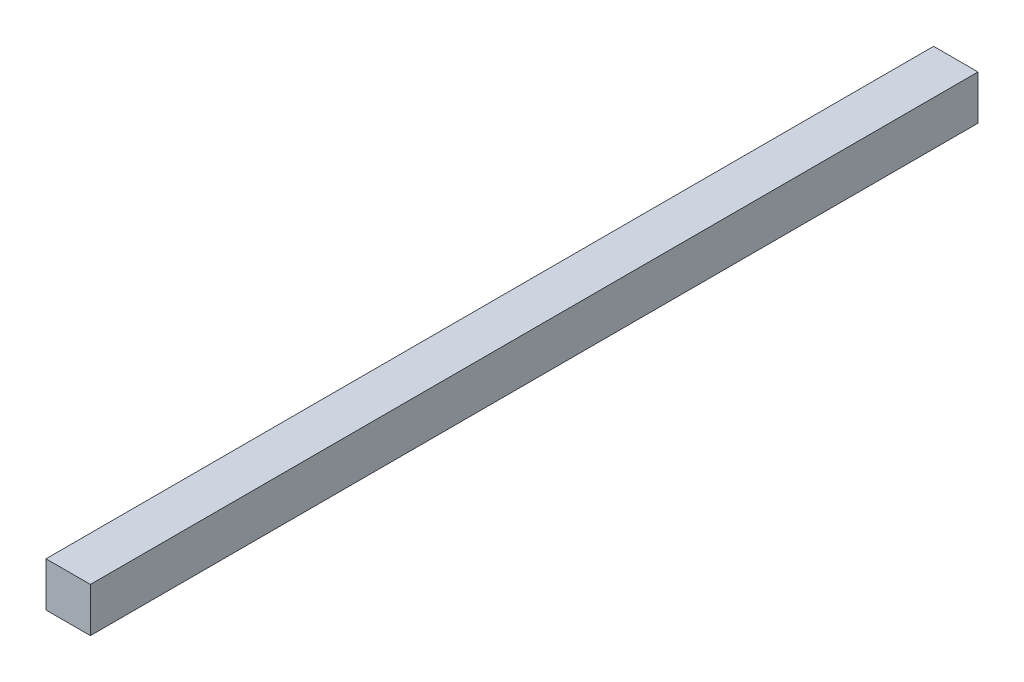
ISO-10303-21;
HEADER;
FILE_DESCRIPTION(('STEP AP214'),'2;1');
FILE_NAME('part.step','',(''),(''),'','','');
FILE_SCHEMA(('AUTOMOTIVE_DESIGN { 1 0 10303 214 1 1 1 1 }'));
ENDSEC;
DATA;
#1=APPLICATION_CONTEXT('core data for automotive mechanical design processes');
#2=APPLICATION_PROTOCOL_DEFINITION('international standard','automotive_design',2000,#1);
#3=PRODUCT_CONTEXT('',#1,'mechanical');
#4=PRODUCT('Part','Part','',(#3));
#5=PRODUCT_RELATED_PRODUCT_CATEGORY('part','',(#4));
#6=PRODUCT_DEFINITION_FORMATION('','',#4);
#7=PRODUCT_DEFINITION_CONTEXT('part definition',#1,'design');
#8=PRODUCT_DEFINITION('design','',#6,#7);
#9=PRODUCT_DEFINITION_SHAPE('','',#8);
#10=(LENGTH_UNIT() NAMED_UNIT(*) SI_UNIT(.MILLI.,.METRE.));
#11=(NAMED_UNIT(*) PLANE_ANGLE_UNIT() SI_UNIT($,.RADIAN.));
#12=(NAMED_UNIT(*) SI_UNIT($,.STERADIAN.) SOLID_ANGLE_UNIT());
#13=UNCERTAINTY_MEASURE_WITH_UNIT(LENGTH_MEASURE(1.E-05),#10,'distance_accuracy_value','');
#14=(GEOMETRIC_REPRESENTATION_CONTEXT(3) GLOBAL_UNCERTAINTY_ASSIGNED_CONTEXT((#13)) GLOBAL_UNIT_ASSIGNED_CONTEXT((#10,
#11,#12)) REPRESENTATION_CONTEXT('',''));
#15=CARTESIAN_POINT('',(0.,0.,0.));
#16=DIRECTION('',(0.,0.,1.));
#17=DIRECTION('',(1.,0.,0.));
#18=AXIS2_PLACEMENT_3D('',#15,#16,#17);
#19=CARTESIAN_POINT('',(-3.,3.,300.));
#20=DIRECTION('',(-1.,0.,0.));
#21=DIRECTION('',(0.,-1.,0.));
#22=AXIS2_PLACEMENT_3D('',#19,#20,#21);
#23=PLANE('',#22);
#24=DIRECTION('',(0.,0.,-1.));
#25=VECTOR('',#24,1.);
#26=CARTESIAN_POINT('',(-3.,3.,300.));
#27=LINE('',#26,#25);
#28=CARTESIAN_POINT('',(-3.,3.,300.));
#29=VERTEX_POINT('',#28);
#30=CARTESIAN_POINT('',(-3.,3.,180.));
#31=VERTEX_POINT('',#30);
#32=EDGE_CURVE('E114',#29,#31,#27,.T.);
#33=ORIENTED_EDGE('',*,*,#32,.T.);
#34=DIRECTION('',(0.,-1.,0.));
#35=VECTOR('',#34,1.);
#36=CARTESIAN_POINT('',(-3.,3.,180.));
#37=LINE('',#36,#35);
#38=CARTESIAN_POINT('',(-3.,-3.,180.));
#39=VERTEX_POINT('',#38);
#40=EDGE_CURVE('E72',#31,#39,#37,.T.);
#41=ORIENTED_EDGE('',*,*,#40,.T.);
#42=DIRECTION('',(0.,0.,-1.));
#43=VECTOR('',#42,1.);
#44=CARTESIAN_POINT('',(-3.,-3.,300.));
#45=LINE('',#44,#43);
#46=CARTESIAN_POINT('',(-3.,-3.,300.));
#47=VERTEX_POINT('',#46);
#48=EDGE_CURVE('E65',#47,#39,#45,.T.);
#49=ORIENTED_EDGE('',*,*,#48,.F.);
#50=DIRECTION('',(0.,1.,0.));
#51=VECTOR('',#50,1.);
#52=CARTESIAN_POINT('',(-3.,3.,300.));
#53=LINE('',#52,#51);
#54=EDGE_CURVE('E79',#47,#29,#53,.T.);
#55=ORIENTED_EDGE('',*,*,#54,.T.);
#56=EDGE_LOOP('',(#33,#41,#49,#55));
#57=FACE_BOUND('',#56,.T.);
#58=ADVANCED_FACE('F57',(#57),#23,.T.);
#59=CARTESIAN_POINT('',(3.,-3.,300.));
#60=DIRECTION('',(0.,-1.,0.));
#61=DIRECTION('',(0.,0.,-1.));
#62=AXIS2_PLACEMENT_3D('',#59,#60,#61);
#63=PLANE('',#62);
#64=ORIENTED_EDGE('',*,*,#48,.T.);
#65=DIRECTION('',(1.,0.,0.));
#66=VECTOR('',#65,1.);
#67=CARTESIAN_POINT('',(3.,-3.,180.));
#68=LINE('',#67,#66);
#69=CARTESIAN_POINT('',(3.,-3.,180.));
#70=VERTEX_POINT('',#69);
#71=EDGE_CURVE('E108',#39,#70,#68,.T.);
#72=ORIENTED_EDGE('',*,*,#71,.T.);
#73=DIRECTION('',(0.,0.,-1.));
#74=VECTOR('',#73,1.);
#75=CARTESIAN_POINT('',(3.,-3.,300.));
#76=LINE('',#75,#74);
#77=CARTESIAN_POINT('',(3.,-3.,300.));
#78=VERTEX_POINT('',#77);
#79=EDGE_CURVE('E107',#78,#70,#76,.T.);
#80=ORIENTED_EDGE('',*,*,#79,.F.);
#81=DIRECTION('',(-1.,0.,0.));
#82=VECTOR('',#81,1.);
#83=CARTESIAN_POINT('',(3.,-3.,300.));
#84=LINE('',#83,#82);
#85=EDGE_CURVE('E117',#78,#47,#84,.T.);
#86=ORIENTED_EDGE('',*,*,#85,.T.);
#87=EDGE_LOOP('',(#64,#72,#80,#86));
#88=FACE_BOUND('',#87,.T.);
#89=ADVANCED_FACE('F129',(#88),#63,.T.);
#90=CARTESIAN_POINT('',(3.,3.,300.));
#91=DIRECTION('',(1.,0.,0.));
#92=DIRECTION('',(0.,1.,0.));
#93=AXIS2_PLACEMENT_3D('',#90,#91,#92);
#94=PLANE('',#93);
#95=ORIENTED_EDGE('',*,*,#79,.T.);
#96=DIRECTION('',(0.,1.,0.));
#97=VECTOR('',#96,1.);
#98=CARTESIAN_POINT('',(3.,3.,180.));
#99=LINE('',#98,#97);
#100=CARTESIAN_POINT('',(3.,3.,180.));
#101=VERTEX_POINT('',#100);
#102=EDGE_CURVE('E97',#70,#101,#99,.T.);
#103=ORIENTED_EDGE('',*,*,#102,.T.);
#104=DIRECTION('',(0.,0.,-1.));
#105=VECTOR('',#104,1.);
#106=CARTESIAN_POINT('',(3.,3.,300.));
#107=LINE('',#106,#105);
#108=CARTESIAN_POINT('',(3.,3.,300.));
#109=VERTEX_POINT('',#108);
#110=EDGE_CURVE('E105',#109,#101,#107,.T.);
#111=ORIENTED_EDGE('',*,*,#110,.F.);
#112=DIRECTION('',(0.,-1.,0.));
#113=VECTOR('',#112,1.);
#114=CARTESIAN_POINT('',(3.,3.,300.));
#115=LINE('',#114,#113);
#116=EDGE_CURVE('E123',#109,#78,#115,.T.);
#117=ORIENTED_EDGE('',*,*,#116,.T.);
#118=EDGE_LOOP('',(#95,#103,#111,#117));
#119=FACE_BOUND('',#118,.T.);
#120=ADVANCED_FACE('F103',(#119),#94,.T.);
#121=CARTESIAN_POINT('',(3.,3.,300.));
#122=DIRECTION('',(0.,1.,0.));
#123=DIRECTION('',(0.,0.,1.));
#124=AXIS2_PLACEMENT_3D('',#121,#122,#123);
#125=PLANE('',#124);
#126=ORIENTED_EDGE('',*,*,#110,.T.);
#127=DIRECTION('',(-1.,0.,0.));
#128=VECTOR('',#127,1.);
#129=CARTESIAN_POINT('',(3.,3.,180.));
#130=LINE('',#129,#128);
#131=EDGE_CURVE('E12',#101,#31,#130,.T.);
#132=ORIENTED_EDGE('',*,*,#131,.T.);
#133=ORIENTED_EDGE('',*,*,#32,.F.);
#134=DIRECTION('',(1.,0.,0.));
#135=VECTOR('',#134,1.);
#136=CARTESIAN_POINT('',(3.,3.,300.));
#137=LINE('',#136,#135);
#138=EDGE_CURVE('E112',#29,#109,#137,.T.);
#139=ORIENTED_EDGE('',*,*,#138,.T.);
#140=EDGE_LOOP('',(#126,#132,#133,#139));
#141=FACE_BOUND('',#140,.T.);
#142=ADVANCED_FACE('F110',(#141),#125,.T.);
#143=CARTESIAN_POINT('',(0.,0.,300.));
#144=DIRECTION('',(0.,0.,1.));
#145=DIRECTION('',(1.,0.,0.));
#146=AXIS2_PLACEMENT_3D('',#143,#144,#145);
#147=PLANE('',#146);
#148=ORIENTED_EDGE('',*,*,#138,.F.);
#149=ORIENTED_EDGE('',*,*,#54,.F.);
#150=ORIENTED_EDGE('',*,*,#85,.F.);
#151=ORIENTED_EDGE('',*,*,#116,.F.);
#152=EDGE_LOOP('',(#148,#149,#150,#151));
#153=FACE_BOUND('',#152,.T.);
#154=ADVANCED_FACE('F59',(#153),#147,.T.);
#155=CARTESIAN_POINT('',(0.,0.,180.));
#156=DIRECTION('',(0.,0.,-1.));
#157=DIRECTION('',(-1.,0.,0.));
#158=AXIS2_PLACEMENT_3D('',#155,#156,#157);
#159=PLANE('',#158);
#160=ORIENTED_EDGE('',*,*,#131,.F.);
#161=ORIENTED_EDGE('',*,*,#102,.F.);
#162=ORIENTED_EDGE('',*,*,#71,.F.);
#163=ORIENTED_EDGE('',*,*,#40,.F.);
#164=EDGE_LOOP('',(#160,#161,#162,#163));
#165=FACE_BOUND('',#164,.T.);
#166=ADVANCED_FACE('F96',(#165),#159,.T.);
#167=CLOSED_SHELL('',(#58,#89,#120,#142,#154,#166));
#168=MANIFOLD_SOLID_BREP('B2',#167);
#169=ADVANCED_BREP_SHAPE_REPRESENTATION('',(#18,#168),#14);
#170=SHAPE_DEFINITION_REPRESENTATION(#9,#169);
ENDSEC;
END-ISO-10303-21;
